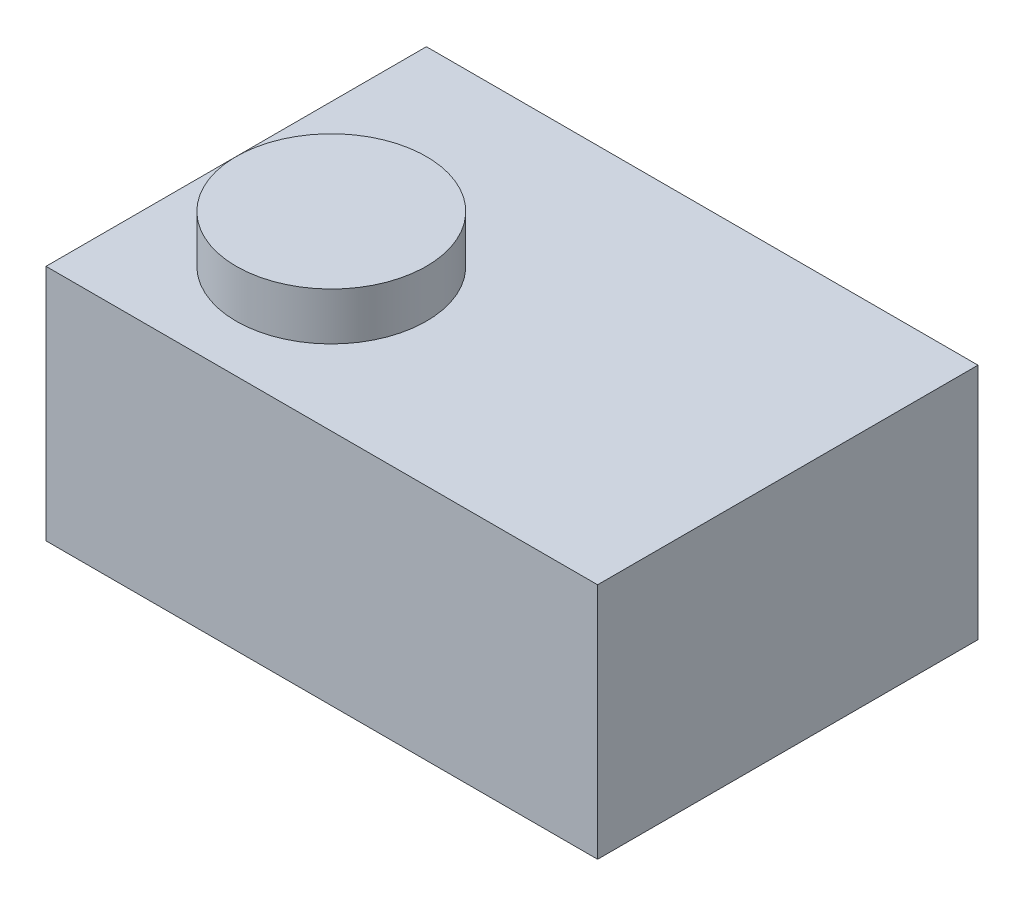
ISO-10303-21;
HEADER;
FILE_DESCRIPTION(('STEP AP214'),'2;1');
FILE_NAME('part.step','',(''),(''),'','','');
FILE_SCHEMA(('AUTOMOTIVE_DESIGN { 1 0 10303 214 1 1 1 1 }'));
ENDSEC;
DATA;
#1=APPLICATION_CONTEXT('core data for automotive mechanical design processes');
#2=APPLICATION_PROTOCOL_DEFINITION('international standard','automotive_design',2000,#1);
#3=PRODUCT_CONTEXT('',#1,'mechanical');
#4=PRODUCT('Part','Part','',(#3));
#5=PRODUCT_RELATED_PRODUCT_CATEGORY('part','',(#4));
#6=PRODUCT_DEFINITION_FORMATION('','',#4);
#7=PRODUCT_DEFINITION_CONTEXT('part definition',#1,'design');
#8=PRODUCT_DEFINITION('design','',#6,#7);
#9=PRODUCT_DEFINITION_SHAPE('','',#8);
#10=(LENGTH_UNIT() NAMED_UNIT(*) SI_UNIT(.MILLI.,.METRE.));
#11=(NAMED_UNIT(*) PLANE_ANGLE_UNIT() SI_UNIT($,.RADIAN.));
#12=(NAMED_UNIT(*) SI_UNIT($,.STERADIAN.) SOLID_ANGLE_UNIT());
#13=UNCERTAINTY_MEASURE_WITH_UNIT(LENGTH_MEASURE(1.E-05),#10,'distance_accuracy_value','');
#14=(GEOMETRIC_REPRESENTATION_CONTEXT(3) GLOBAL_UNCERTAINTY_ASSIGNED_CONTEXT((#13)) GLOBAL_UNIT_ASSIGNED_CONTEXT((#10,
#11,#12)) REPRESENTATION_CONTEXT('',''));
#15=CARTESIAN_POINT('',(0.,0.,0.));
#16=DIRECTION('',(0.,0.,1.));
#17=DIRECTION('',(1.,0.,0.));
#18=AXIS2_PLACEMENT_3D('',#15,#16,#17);
#19=CARTESIAN_POINT('',(-27.8265895953757,25.,-20.5780346820809));
#20=DIRECTION('',(1.,0.,0.));
#21=DIRECTION('',(0.,0.,-1.));
#22=AXIS2_PLACEMENT_3D('',#19,#20,#21);
#23=PLANE('',#22);
#24=DIRECTION('',(0.,0.,1.));
#25=VECTOR('',#24,1.);
#26=CARTESIAN_POINT('',(-27.8265895953757,0.,-20.5780346820809));
#27=LINE('',#26,#25);
#28=CARTESIAN_POINT('',(-27.8265895953757,0.,-20.5780346820809));
#29=VERTEX_POINT('',#28);
#30=CARTESIAN_POINT('',(-27.8265895953757,0.,19.4219653179191));
#31=VERTEX_POINT('',#30);
#32=EDGE_CURVE('E101',#29,#31,#27,.T.);
#33=ORIENTED_EDGE('',*,*,#32,.T.);
#34=DIRECTION('',(0.,-1.,0.));
#35=VECTOR('',#34,1.);
#36=CARTESIAN_POINT('',(-27.8265895953757,25.,19.4219653179191));
#37=LINE('',#36,#35);
#38=CARTESIAN_POINT('',(-27.8265895953757,25.,19.4219653179191));
#39=VERTEX_POINT('',#38);
#40=EDGE_CURVE('E11',#39,#31,#37,.T.);
#41=ORIENTED_EDGE('',*,*,#40,.F.);
#42=DIRECTION('',(0.,0.,1.));
#43=VECTOR('',#42,1.);
#44=CARTESIAN_POINT('',(-27.8265895953757,25.,-20.5780346820809));
#45=LINE('',#44,#43);
#46=CARTESIAN_POINT('',(-27.8265895953757,25.,-20.5780346820809));
#47=VERTEX_POINT('',#46);
#48=EDGE_CURVE('E89',#47,#39,#45,.T.);
#49=ORIENTED_EDGE('',*,*,#48,.F.);
#50=DIRECTION('',(0.,-1.,0.));
#51=VECTOR('',#50,1.);
#52=CARTESIAN_POINT('',(-27.8265895953757,25.,-20.5780346820809));
#53=LINE('',#52,#51);
#54=EDGE_CURVE('E97',#47,#29,#53,.T.);
#55=ORIENTED_EDGE('',*,*,#54,.T.);
#56=EDGE_LOOP('',(#33,#41,#49,#55));
#57=FACE_BOUND('',#56,.T.);
#58=ADVANCED_FACE('F38',(#57),#23,.F.);
#59=CARTESIAN_POINT('',(-27.8265895953757,25.,19.4219653179191));
#60=DIRECTION('',(0.,0.,-1.));
#61=DIRECTION('',(-1.,0.,0.));
#62=AXIS2_PLACEMENT_3D('',#59,#60,#61);
#63=PLANE('',#62);
#64=DIRECTION('',(1.,0.,0.));
#65=VECTOR('',#64,1.);
#66=CARTESIAN_POINT('',(-27.8265895953757,0.,19.4219653179191));
#67=LINE('',#66,#65);
#68=CARTESIAN_POINT('',(30.1734104046243,0.,19.4219653179191));
#69=VERTEX_POINT('',#68);
#70=EDGE_CURVE('E93',#31,#69,#67,.T.);
#71=ORIENTED_EDGE('',*,*,#70,.T.);
#72=DIRECTION('',(0.,-1.,0.));
#73=VECTOR('',#72,1.);
#74=CARTESIAN_POINT('',(30.1734104046243,25.,19.4219653179191));
#75=LINE('',#74,#73);
#76=CARTESIAN_POINT('',(30.1734104046243,25.,19.4219653179191));
#77=VERTEX_POINT('',#76);
#78=EDGE_CURVE('E46',#77,#69,#75,.T.);
#79=ORIENTED_EDGE('',*,*,#78,.F.);
#80=DIRECTION('',(1.,0.,0.));
#81=VECTOR('',#80,1.);
#82=CARTESIAN_POINT('',(-27.8265895953757,25.,19.4219653179191));
#83=LINE('',#82,#81);
#84=EDGE_CURVE('E84',#39,#77,#83,.T.);
#85=ORIENTED_EDGE('',*,*,#84,.F.);
#86=ORIENTED_EDGE('',*,*,#40,.T.);
#87=EDGE_LOOP('',(#71,#79,#85,#86));
#88=FACE_BOUND('',#87,.T.);
#89=ADVANCED_FACE('F92',(#88),#63,.F.);
#90=CARTESIAN_POINT('',(30.1734104046243,25.,-20.5780346820809));
#91=DIRECTION('',(-1.,0.,0.));
#92=DIRECTION('',(0.,0.,1.));
#93=AXIS2_PLACEMENT_3D('',#90,#91,#92);
#94=PLANE('',#93);
#95=DIRECTION('',(0.,0.,-1.));
#96=VECTOR('',#95,1.);
#97=CARTESIAN_POINT('',(30.1734104046243,0.,-20.5780346820809));
#98=LINE('',#97,#96);
#99=CARTESIAN_POINT('',(30.1734104046243,0.,-20.5780346820809));
#100=VERTEX_POINT('',#99);
#101=EDGE_CURVE('E71',#69,#100,#98,.T.);
#102=ORIENTED_EDGE('',*,*,#101,.T.);
#103=DIRECTION('',(0.,-1.,0.));
#104=VECTOR('',#103,1.);
#105=CARTESIAN_POINT('',(30.1734104046243,25.,-20.5780346820809));
#106=LINE('',#105,#104);
#107=CARTESIAN_POINT('',(30.1734104046243,25.,-20.5780346820809));
#108=VERTEX_POINT('',#107);
#109=EDGE_CURVE('E94',#108,#100,#106,.T.);
#110=ORIENTED_EDGE('',*,*,#109,.F.);
#111=DIRECTION('',(0.,0.,-1.));
#112=VECTOR('',#111,1.);
#113=CARTESIAN_POINT('',(30.1734104046243,25.,-20.5780346820809));
#114=LINE('',#113,#112);
#115=EDGE_CURVE('E87',#77,#108,#114,.T.);
#116=ORIENTED_EDGE('',*,*,#115,.F.);
#117=ORIENTED_EDGE('',*,*,#78,.T.);
#118=EDGE_LOOP('',(#102,#110,#116,#117));
#119=FACE_BOUND('',#118,.T.);
#120=ADVANCED_FACE('F95',(#119),#94,.F.);
#121=CARTESIAN_POINT('',(-27.8265895953757,25.,-20.5780346820809));
#122=DIRECTION('',(0.,0.,1.));
#123=DIRECTION('',(1.,0.,0.));
#124=AXIS2_PLACEMENT_3D('',#121,#122,#123);
#125=PLANE('',#124);
#126=DIRECTION('',(-1.,0.,0.));
#127=VECTOR('',#126,1.);
#128=CARTESIAN_POINT('',(-27.8265895953757,0.,-20.5780346820809));
#129=LINE('',#128,#127);
#130=EDGE_CURVE('E77',#100,#29,#129,.T.);
#131=ORIENTED_EDGE('',*,*,#130,.T.);
#132=ORIENTED_EDGE('',*,*,#54,.F.);
#133=DIRECTION('',(-1.,0.,0.));
#134=VECTOR('',#133,1.);
#135=CARTESIAN_POINT('',(-27.8265895953757,25.,-20.5780346820809));
#136=LINE('',#135,#134);
#137=EDGE_CURVE('E54',#108,#47,#136,.T.);
#138=ORIENTED_EDGE('',*,*,#137,.F.);
#139=ORIENTED_EDGE('',*,*,#109,.T.);
#140=EDGE_LOOP('',(#131,#132,#138,#139));
#141=FACE_BOUND('',#140,.T.);
#142=ADVANCED_FACE('F109',(#141),#125,.F.);
#143=CARTESIAN_POINT('',(0.,25.,0.));
#144=DIRECTION('',(0.,1.,0.));
#145=DIRECTION('',(0.,0.,1.));
#146=AXIS2_PLACEMENT_3D('',#143,#144,#145);
#147=PLANE('',#146);
#148=CARTESIAN_POINT('',(-12.8265895953757,25.,4.42196531791907));
#149=DIRECTION('',(0.,1.,0.));
#150=DIRECTION('',(0.,0.,1.));
#151=AXIS2_PLACEMENT_3D('',#148,#149,#150);
#152=CIRCLE('',#151,10.);
#153=CARTESIAN_POINT('',(-12.8265895953757,25.,14.4219653179191));
#154=VERTEX_POINT('',#153);
#155=EDGE_CURVE('E115',#154,#154,#152,.T.);
#156=ORIENTED_EDGE('',*,*,#155,.F.);
#157=EDGE_LOOP('',(#156));
#158=FACE_BOUND('',#157,.T.);
#159=ORIENTED_EDGE('',*,*,#48,.T.);
#160=ORIENTED_EDGE('',*,*,#84,.T.);
#161=ORIENTED_EDGE('',*,*,#115,.T.);
#162=ORIENTED_EDGE('',*,*,#137,.T.);
#163=EDGE_LOOP('',(#159,#160,#161,#162));
#164=FACE_BOUND('',#163,.T.);
#165=ADVANCED_FACE('F85',(#158,#164),#147,.T.);
#166=CARTESIAN_POINT('',(0.,0.,0.));
#167=DIRECTION('',(0.,1.,0.));
#168=DIRECTION('',(0.,0.,1.));
#169=AXIS2_PLACEMENT_3D('',#166,#167,#168);
#170=PLANE('',#169);
#171=ORIENTED_EDGE('',*,*,#32,.F.);
#172=ORIENTED_EDGE('',*,*,#130,.F.);
#173=ORIENTED_EDGE('',*,*,#101,.F.);
#174=ORIENTED_EDGE('',*,*,#70,.F.);
#175=EDGE_LOOP('',(#171,#172,#173,#174));
#176=FACE_BOUND('',#175,.T.);
#177=ADVANCED_FACE('F112',(#176),#170,.F.);
#178=CARTESIAN_POINT('',(-12.8265895953757,30.,4.42196531791907));
#179=DIRECTION('',(0.,-1.,0.));
#180=DIRECTION('',(0.,0.,-1.));
#181=AXIS2_PLACEMENT_3D('',#178,#179,#180);
#182=CYLINDRICAL_SURFACE('',#181,10.);
#183=CARTESIAN_POINT('',(-12.8265895953757,30.,4.42196531791907));
#184=DIRECTION('',(0.,1.,0.));
#185=DIRECTION('',(0.,0.,1.));
#186=AXIS2_PLACEMENT_3D('',#183,#184,#185);
#187=CIRCLE('',#186,10.);
#188=CARTESIAN_POINT('',(-12.8265895953757,30.,14.4219653179191));
#189=VERTEX_POINT('',#188);
#190=EDGE_CURVE('E104',#189,#189,#187,.T.);
#191=ORIENTED_EDGE('',*,*,#190,.F.);
#192=EDGE_LOOP('',(#191));
#193=FACE_BOUND('',#192,.T.);
#194=ORIENTED_EDGE('',*,*,#155,.T.);
#195=EDGE_LOOP('',(#194));
#196=FACE_BOUND('',#195,.T.);
#197=ADVANCED_FACE('F123',(#193,#196),#182,.T.);
#198=CARTESIAN_POINT('',(-12.8265895953757,30.,4.42196531791907));
#199=DIRECTION('',(0.,1.,0.));
#200=DIRECTION('',(0.,0.,1.));
#201=AXIS2_PLACEMENT_3D('',#198,#199,#200);
#202=PLANE('',#201);
#203=ORIENTED_EDGE('',*,*,#190,.T.);
#204=EDGE_LOOP('',(#203));
#205=FACE_BOUND('',#204,.T.);
#206=ADVANCED_FACE('F121',(#205),#202,.T.);
#207=CLOSED_SHELL('',(#58,#89,#120,#142,#165,#177,#197,#206));
#208=MANIFOLD_SOLID_BREP('B2',#207);
#209=ADVANCED_BREP_SHAPE_REPRESENTATION('',(#18,#208),#14);
#210=SHAPE_DEFINITION_REPRESENTATION(#9,#209);
ENDSEC;
END-ISO-10303-21;
